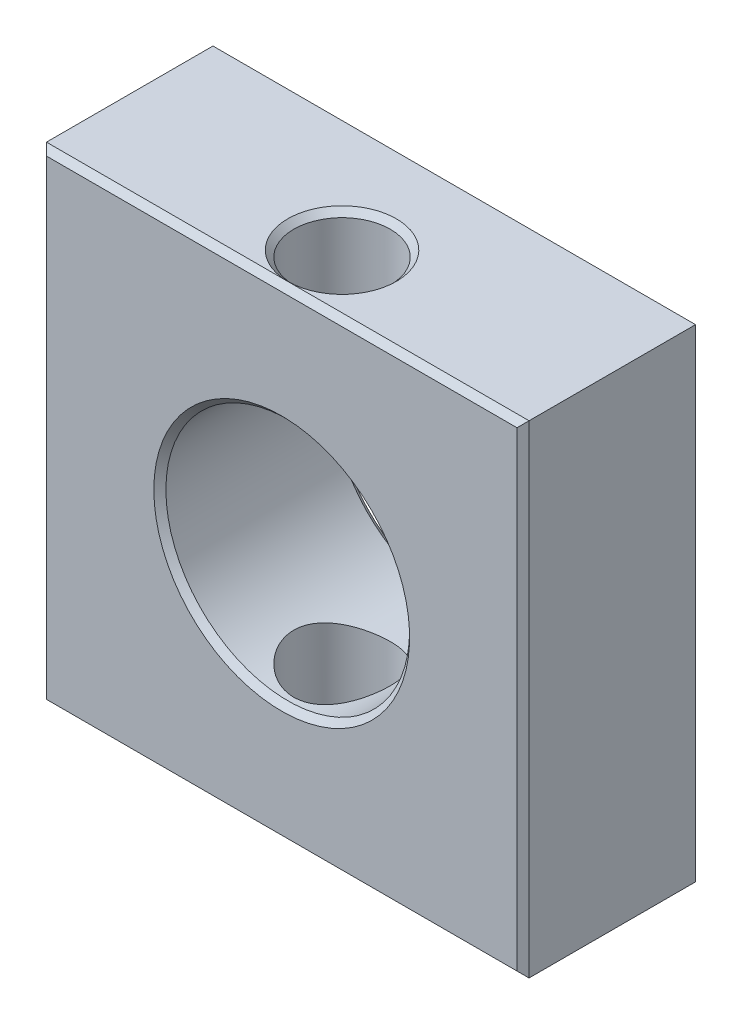
ISO-10303-21;
HEADER;
FILE_DESCRIPTION(('STEP AP214'),'2;1');
FILE_NAME('part.step','',(''),(''),'','','');
FILE_SCHEMA(('AUTOMOTIVE_DESIGN { 1 0 10303 214 1 1 1 1 }'));
ENDSEC;
DATA;
#1=APPLICATION_CONTEXT('core data for automotive mechanical design processes');
#2=APPLICATION_PROTOCOL_DEFINITION('international standard','automotive_design',2000,#1);
#3=PRODUCT_CONTEXT('',#1,'mechanical');
#4=PRODUCT('Part','Part','',(#3));
#5=PRODUCT_RELATED_PRODUCT_CATEGORY('part','',(#4));
#6=PRODUCT_DEFINITION_FORMATION('','',#4);
#7=PRODUCT_DEFINITION_CONTEXT('part definition',#1,'design');
#8=PRODUCT_DEFINITION('design','',#6,#7);
#9=PRODUCT_DEFINITION_SHAPE('','',#8);
#10=(LENGTH_UNIT() NAMED_UNIT(*) SI_UNIT(.MILLI.,.METRE.));
#11=(NAMED_UNIT(*) PLANE_ANGLE_UNIT() SI_UNIT($,.RADIAN.));
#12=(NAMED_UNIT(*) SI_UNIT($,.STERADIAN.) SOLID_ANGLE_UNIT());
#13=UNCERTAINTY_MEASURE_WITH_UNIT(LENGTH_MEASURE(1.E-05),#10,'distance_accuracy_value','');
#14=(GEOMETRIC_REPRESENTATION_CONTEXT(3) GLOBAL_UNCERTAINTY_ASSIGNED_CONTEXT((#13)) GLOBAL_UNIT_ASSIGNED_CONTEXT((#10,
#11,#12)) REPRESENTATION_CONTEXT('',''));
#15=CARTESIAN_POINT('',(0.,0.,0.));
#16=DIRECTION('',(0.,0.,1.));
#17=DIRECTION('',(1.,0.,0.));
#18=AXIS2_PLACEMENT_3D('',#15,#16,#17);
#19=CARTESIAN_POINT('',(0.,0.,7.4));
#20=DIRECTION('',(0.,0.,-1.));
#21=DIRECTION('',(-1.,0.,0.));
#22=AXIS2_PLACEMENT_3D('',#19,#20,#21);
#23=PLANE('',#22);
#24=CARTESIAN_POINT('',(0.,0.,7.4));
#25=DIRECTION('',(0.,0.,-1.));
#26=DIRECTION('',(-1.,0.,0.));
#27=AXIS2_PLACEMENT_3D('',#24,#25,#26);
#28=CIRCLE('',#27,5.3);
#29=CARTESIAN_POINT('',(-5.3,0.,7.4));
#30=VERTEX_POINT('',#29);
#31=EDGE_CURVE('E212',#30,#30,#28,.T.);
#32=ORIENTED_EDGE('',*,*,#31,.T.);
#33=EDGE_LOOP('',(#32));
#34=FACE_BOUND('',#33,.T.);
#35=DIRECTION('',(0.,-1.,0.));
#36=VECTOR('',#35,1.);
#37=CARTESIAN_POINT('',(-9.75,0.,7.4));
#38=LINE('',#37,#36);
#39=CARTESIAN_POINT('',(-9.75,9.75000000000001,7.4));
#40=VERTEX_POINT('',#39);
#41=CARTESIAN_POINT('',(-9.75,-9.75,7.4));
#42=VERTEX_POINT('',#41);
#43=EDGE_CURVE('E60',#40,#42,#38,.T.);
#44=ORIENTED_EDGE('',*,*,#43,.T.);
#45=DIRECTION('',(1.,0.,0.));
#46=VECTOR('',#45,1.);
#47=CARTESIAN_POINT('',(0.,-9.75,7.4));
#48=LINE('',#47,#46);
#49=CARTESIAN_POINT('',(9.75,-9.75,7.4));
#50=VERTEX_POINT('',#49);
#51=EDGE_CURVE('E209',#42,#50,#48,.T.);
#52=ORIENTED_EDGE('',*,*,#51,.T.);
#53=DIRECTION('',(0.,1.,0.));
#54=VECTOR('',#53,1.);
#55=CARTESIAN_POINT('',(9.75,0.,7.4));
#56=LINE('',#55,#54);
#57=CARTESIAN_POINT('',(9.75,9.75000000000001,7.4));
#58=VERTEX_POINT('',#57);
#59=EDGE_CURVE('E202',#50,#58,#56,.T.);
#60=ORIENTED_EDGE('',*,*,#59,.T.);
#61=DIRECTION('',(-1.,0.,0.));
#62=VECTOR('',#61,1.);
#63=CARTESIAN_POINT('',(0.,9.75000000000001,7.4));
#64=LINE('',#63,#62);
#65=EDGE_CURVE('E65',#58,#40,#64,.T.);
#66=ORIENTED_EDGE('',*,*,#65,.T.);
#67=EDGE_LOOP('',(#44,#52,#60,#66));
#68=FACE_BOUND('',#67,.T.);
#69=ADVANCED_FACE('F41',(#34,#68),#23,.F.);
#70=CARTESIAN_POINT('',(0.,0.,0.));
#71=DIRECTION('',(0.,0.,-1.));
#72=DIRECTION('',(-1.,0.,0.));
#73=AXIS2_PLACEMENT_3D('',#70,#71,#72);
#74=PLANE('',#73);
#75=CARTESIAN_POINT('',(0.,0.,0.));
#76=DIRECTION('',(0.,0.,-1.));
#77=DIRECTION('',(-1.,0.,0.));
#78=AXIS2_PLACEMENT_3D('',#75,#76,#77);
#79=CIRCLE('',#78,5.3);
#80=CARTESIAN_POINT('',(-5.3,0.,0.));
#81=VERTEX_POINT('',#80);
#82=EDGE_CURVE('E146',#81,#81,#79,.F.);
#83=ORIENTED_EDGE('',*,*,#82,.T.);
#84=EDGE_LOOP('',(#83));
#85=FACE_BOUND('',#84,.T.);
#86=DIRECTION('',(0.,1.,0.));
#87=VECTOR('',#86,1.);
#88=CARTESIAN_POINT('',(-9.75,10.,0.));
#89=LINE('',#88,#87);
#90=CARTESIAN_POINT('',(-9.75,-9.75,0.));
#91=VERTEX_POINT('',#90);
#92=CARTESIAN_POINT('',(-9.75,9.75,0.));
#93=VERTEX_POINT('',#92);
#94=EDGE_CURVE('E144',#91,#93,#89,.T.);
#95=ORIENTED_EDGE('',*,*,#94,.T.);
#96=DIRECTION('',(1.,0.,0.));
#97=VECTOR('',#96,1.);
#98=CARTESIAN_POINT('',(10.,9.75,0.));
#99=LINE('',#98,#97);
#100=CARTESIAN_POINT('',(9.75,9.75,0.));
#101=VERTEX_POINT('',#100);
#102=EDGE_CURVE('E121',#93,#101,#99,.T.);
#103=ORIENTED_EDGE('',*,*,#102,.T.);
#104=DIRECTION('',(0.,-1.,0.));
#105=VECTOR('',#104,1.);
#106=CARTESIAN_POINT('',(9.75,-10.,0.));
#107=LINE('',#106,#105);
#108=CARTESIAN_POINT('',(9.75,-9.75,0.));
#109=VERTEX_POINT('',#108);
#110=EDGE_CURVE('E132',#101,#109,#107,.T.);
#111=ORIENTED_EDGE('',*,*,#110,.T.);
#112=DIRECTION('',(-1.,0.,0.));
#113=VECTOR('',#112,1.);
#114=CARTESIAN_POINT('',(-10.,-9.75,0.));
#115=LINE('',#114,#113);
#116=EDGE_CURVE('E139',#109,#91,#115,.T.);
#117=ORIENTED_EDGE('',*,*,#116,.T.);
#118=EDGE_LOOP('',(#95,#103,#111,#117));
#119=FACE_BOUND('',#118,.T.);
#120=ADVANCED_FACE('F142',(#85,#119),#74,.T.);
#121=CARTESIAN_POINT('',(10.,-10.,7.4));
#122=DIRECTION('',(-1.,0.,0.));
#123=DIRECTION('',(0.,0.,1.));
#124=AXIS2_PLACEMENT_3D('',#121,#122,#123);
#125=PLANE('',#124);
#126=DIRECTION('',(0.,0.,-1.));
#127=VECTOR('',#126,1.);
#128=CARTESIAN_POINT('',(10.,-10.,7.4));
#129=LINE('',#128,#127);
#130=CARTESIAN_POINT('',(10.,-10.,7.15));
#131=VERTEX_POINT('',#130);
#132=CARTESIAN_POINT('',(10.,-10.,0.249999999999997));
#133=VERTEX_POINT('',#132);
#134=EDGE_CURVE('E263',#131,#133,#129,.T.);
#135=ORIENTED_EDGE('',*,*,#134,.T.);
#136=DIRECTION('',(0.,1.,0.));
#137=VECTOR('',#136,1.);
#138=CARTESIAN_POINT('',(10.,10.,0.249999999999997));
#139=LINE('',#138,#137);
#140=CARTESIAN_POINT('',(10.,10.,0.249999999999997));
#141=VERTEX_POINT('',#140);
#142=EDGE_CURVE('E199',#133,#141,#139,.T.);
#143=ORIENTED_EDGE('',*,*,#142,.T.);
#144=DIRECTION('',(0.,0.,-1.));
#145=VECTOR('',#144,1.);
#146=CARTESIAN_POINT('',(10.,10.,7.4));
#147=LINE('',#146,#145);
#148=CARTESIAN_POINT('',(10.,10.,7.15));
#149=VERTEX_POINT('',#148);
#150=EDGE_CURVE('E140',#149,#141,#147,.T.);
#151=ORIENTED_EDGE('',*,*,#150,.F.);
#152=DIRECTION('',(0.,-1.,0.));
#153=VECTOR('',#152,1.);
#154=CARTESIAN_POINT('',(10.,-10.,7.15));
#155=LINE('',#154,#153);
#156=EDGE_CURVE('E196',#149,#131,#155,.T.);
#157=ORIENTED_EDGE('',*,*,#156,.T.);
#158=EDGE_LOOP('',(#135,#143,#151,#157));
#159=FACE_BOUND('',#158,.T.);
#160=ADVANCED_FACE('F302',(#159),#125,.F.);
#161=CARTESIAN_POINT('',(-10.,10.,7.4));
#162=DIRECTION('',(0.,-1.,0.));
#163=DIRECTION('',(0.,0.,-1.));
#164=AXIS2_PLACEMENT_3D('',#161,#162,#163);
#165=PLANE('',#164);
#166=ORIENTED_EDGE('',*,*,#150,.T.);
#167=DIRECTION('',(-1.,0.,0.));
#168=VECTOR('',#167,1.);
#169=CARTESIAN_POINT('',(-10.,10.,0.249999999999997));
#170=LINE('',#169,#168);
#171=CARTESIAN_POINT('',(-10.,10.,0.249999999999997));
#172=VERTEX_POINT('',#171);
#173=EDGE_CURVE('E124',#141,#172,#170,.T.);
#174=ORIENTED_EDGE('',*,*,#173,.T.);
#175=DIRECTION('',(0.,0.,-1.));
#176=VECTOR('',#175,1.);
#177=CARTESIAN_POINT('',(-10.,10.,7.4));
#178=LINE('',#177,#176);
#179=CARTESIAN_POINT('',(-10.,10.,7.15));
#180=VERTEX_POINT('',#179);
#181=EDGE_CURVE('E254',#180,#172,#178,.T.);
#182=ORIENTED_EDGE('',*,*,#181,.F.);
#183=DIRECTION('',(1.,0.,0.));
#184=VECTOR('',#183,1.);
#185=CARTESIAN_POINT('',(-10.,10.,7.15));
#186=LINE('',#185,#184);
#187=CARTESIAN_POINT('',(0.,10.,7.15));
#188=VERTEX_POINT('',#187);
#189=EDGE_CURVE('E170',#180,#188,#186,.T.);
#190=ORIENTED_EDGE('',*,*,#189,.T.);
#191=CARTESIAN_POINT('',(0.,10.,4.9));
#192=DIRECTION('',(0.,-1.,0.));
#193=DIRECTION('',(0.,0.,-1.));
#194=AXIS2_PLACEMENT_3D('',#191,#192,#193);
#195=CIRCLE('',#194,2.25);
#196=EDGE_CURVE('E163',#188,#188,#195,.T.);
#197=ORIENTED_EDGE('',*,*,#196,.T.);
#198=DIRECTION('',(1.,0.,0.));
#199=VECTOR('',#198,1.);
#200=CARTESIAN_POINT('',(-10.,10.,7.15));
#201=LINE('',#200,#199);
#202=EDGE_CURVE('E167',#188,#149,#201,.T.);
#203=ORIENTED_EDGE('',*,*,#202,.T.);
#204=EDGE_LOOP('',(#166,#174,#182,#190,#197,#203));
#205=FACE_BOUND('',#204,.T.);
#206=ADVANCED_FACE('F252',(#205),#165,.F.);
#207=CARTESIAN_POINT('',(-10.,-10.,7.4));
#208=DIRECTION('',(1.,0.,0.));
#209=DIRECTION('',(0.,0.,-1.));
#210=AXIS2_PLACEMENT_3D('',#207,#208,#209);
#211=PLANE('',#210);
#212=ORIENTED_EDGE('',*,*,#181,.T.);
#213=DIRECTION('',(0.,-1.,0.));
#214=VECTOR('',#213,1.);
#215=CARTESIAN_POINT('',(-10.,-10.,0.249999999999997));
#216=LINE('',#215,#214);
#217=CARTESIAN_POINT('',(-10.,-10.,0.249999999999997));
#218=VERTEX_POINT('',#217);
#219=EDGE_CURVE('E179',#172,#218,#216,.T.);
#220=ORIENTED_EDGE('',*,*,#219,.T.);
#221=DIRECTION('',(0.,0.,-1.));
#222=VECTOR('',#221,1.);
#223=CARTESIAN_POINT('',(-10.,-10.,7.4));
#224=LINE('',#223,#222);
#225=CARTESIAN_POINT('',(-10.,-10.,7.15));
#226=VERTEX_POINT('',#225);
#227=EDGE_CURVE('E257',#226,#218,#224,.T.);
#228=ORIENTED_EDGE('',*,*,#227,.F.);
#229=DIRECTION('',(0.,1.,0.));
#230=VECTOR('',#229,1.);
#231=CARTESIAN_POINT('',(-10.,-10.,7.15));
#232=LINE('',#231,#230);
#233=EDGE_CURVE('E176',#226,#180,#232,.T.);
#234=ORIENTED_EDGE('',*,*,#233,.T.);
#235=EDGE_LOOP('',(#212,#220,#228,#234));
#236=FACE_BOUND('',#235,.T.);
#237=ADVANCED_FACE('F308',(#236),#211,.F.);
#238=CARTESIAN_POINT('',(-10.,-10.,7.4));
#239=DIRECTION('',(0.,1.,0.));
#240=DIRECTION('',(0.,0.,1.));
#241=AXIS2_PLACEMENT_3D('',#238,#239,#240);
#242=PLANE('',#241);
#243=ORIENTED_EDGE('',*,*,#227,.T.);
#244=DIRECTION('',(1.,0.,0.));
#245=VECTOR('',#244,1.);
#246=CARTESIAN_POINT('',(10.,-10.,0.249999999999997));
#247=LINE('',#246,#245);
#248=EDGE_CURVE('E193',#218,#133,#247,.T.);
#249=ORIENTED_EDGE('',*,*,#248,.T.);
#250=ORIENTED_EDGE('',*,*,#134,.F.);
#251=DIRECTION('',(-1.,0.,0.));
#252=VECTOR('',#251,1.);
#253=CARTESIAN_POINT('',(-10.,-10.,7.15));
#254=LINE('',#253,#252);
#255=CARTESIAN_POINT('',(0.,-10.,7.15));
#256=VERTEX_POINT('',#255);
#257=EDGE_CURVE('E189',#131,#256,#254,.T.);
#258=ORIENTED_EDGE('',*,*,#257,.T.);
#259=CARTESIAN_POINT('',(0.,-10.,4.9));
#260=DIRECTION('',(0.,1.,0.));
#261=DIRECTION('',(0.,0.,1.));
#262=AXIS2_PLACEMENT_3D('',#259,#260,#261);
#263=CIRCLE('',#262,2.25);
#264=EDGE_CURVE('E182',#256,#256,#263,.T.);
#265=ORIENTED_EDGE('',*,*,#264,.T.);
#266=DIRECTION('',(-1.,0.,0.));
#267=VECTOR('',#266,1.);
#268=CARTESIAN_POINT('',(-10.,-10.,7.15));
#269=LINE('',#268,#267);
#270=EDGE_CURVE('E186',#256,#226,#269,.T.);
#271=ORIENTED_EDGE('',*,*,#270,.T.);
#272=EDGE_LOOP('',(#243,#249,#250,#258,#265,#271));
#273=FACE_BOUND('',#272,.T.);
#274=ADVANCED_FACE('F294',(#273),#242,.F.);
#275=CARTESIAN_POINT('',(0.,0.,7.4));
#276=DIRECTION('',(0.,0.,-1.));
#277=DIRECTION('',(-1.,0.,0.));
#278=AXIS2_PLACEMENT_3D('',#275,#276,#277);
#279=CYLINDRICAL_SURFACE('',#278,5.05);
#280=CARTESIAN_POINT('',(0.,0.,0.250000000000001));
#281=DIRECTION('',(0.,0.,-1.));
#282=DIRECTION('',(-1.,0.,0.));
#283=AXIS2_PLACEMENT_3D('',#280,#281,#282);
#284=CIRCLE('',#283,5.05);
#285=CARTESIAN_POINT('',(-5.05,0.,0.250000000000001));
#286=VERTEX_POINT('',#285);
#287=EDGE_CURVE('E159',#286,#286,#284,.T.);
#288=ORIENTED_EDGE('',*,*,#287,.T.);
#289=EDGE_LOOP('',(#288));
#290=FACE_BOUND('',#289,.T.);
#291=CARTESIAN_POINT('',(0.,0.,7.15));
#292=DIRECTION('',(0.,0.,-1.));
#293=DIRECTION('',(-1.,0.,0.));
#294=AXIS2_PLACEMENT_3D('',#291,#292,#293);
#295=CIRCLE('',#294,5.05);
#296=CARTESIAN_POINT('',(-5.05,0.,7.15));
#297=VERTEX_POINT('',#296);
#298=EDGE_CURVE('E151',#297,#297,#295,.F.);
#299=ORIENTED_EDGE('',*,*,#298,.T.);
#300=EDGE_LOOP('',(#299));
#301=FACE_BOUND('',#300,.T.);
#302=CARTESIAN_POINT('',(0.,-5.05,6.9));
#303=CARTESIAN_POINT('',(0.107606923407257,-5.04999190030314,6.89998888088055));
#304=CARTESIAN_POINT('',(0.215372150571609,-5.04652109783298,6.89126627786824));
#305=CARTESIAN_POINT('',(0.427862910360448,-5.03297536591887,6.85667608369071));
#306=CARTESIAN_POINT('',(0.532580032634758,-5.02288369491007,6.83076502785778));
#307=CARTESIAN_POINT('',(0.735570102037394,-4.99718593345495,6.76288695758719));
#308=CARTESIAN_POINT('',(0.833862341414831,-4.98159734457333,6.72097086668627));
#309=CARTESIAN_POINT('',(1.02193859653296,-4.94644389580464,6.62247419051256));
#310=CARTESIAN_POINT('',(1.11172513968645,-4.92688022255654,6.56589798018252));
#311=CARTESIAN_POINT('',(1.28452104218351,-4.88474645370079,6.43691703688315));
#312=CARTESIAN_POINT('',(1.36708426934581,-4.86208430423305,6.36394490901279));
#313=CARTESIAN_POINT('',(1.51917593364277,-4.81673287826779,6.20544167419001));
#314=CARTESIAN_POINT('',(1.58869830209108,-4.79404359406112,6.11990475294462));
#315=CARTESIAN_POINT('',(1.71570812214043,-4.7501120595874,5.93418497510735));
#316=CARTESIAN_POINT('',(1.77254158183707,-4.7289754846863,5.83352730850341));
#317=CARTESIAN_POINT('',(1.86827242887644,-4.69198377265426,5.62311790190743));
#318=CARTESIAN_POINT('',(1.90717810703915,-4.67612619516004,5.51337039333095));
#319=CARTESIAN_POINT('',(1.96415260926031,-4.65247495964192,5.29302208011897));
#320=CARTESIAN_POINT('',(1.98307467215481,-4.64435269449542,5.18267843819949));
#321=CARTESIAN_POINT('',(2.00221059278242,-4.63613766680588,4.96010628966715));
#322=CARTESIAN_POINT('',(2.00243341290737,-4.63604105763277,4.84787871180796));
#323=CARTESIAN_POINT('',(1.98481210142394,-4.64360743115311,4.63285800635808));
#324=CARTESIAN_POINT('',(1.96819519526939,-4.65074333585307,4.52994218054293));
#325=CARTESIAN_POINT('',(1.9194095435463,-4.67108746187081,4.32850091931688));
#326=CARTESIAN_POINT('',(1.88723814237041,-4.68429672006884,4.22997623674086));
#327=CARTESIAN_POINT('',(1.807648699654,-4.7155868690567,4.0377653807596));
#328=CARTESIAN_POINT('',(1.75993599802411,-4.73376071632039,3.94421702408108));
#329=CARTESIAN_POINT('',(1.65082495091307,-4.77290587847201,3.76611559676011));
#330=CARTESIAN_POINT('',(1.58942152965393,-4.79387822973287,3.68156587954619));
#331=CARTESIAN_POINT('',(1.44921077922004,-4.83819012693915,3.51713152662959));
#332=CARTESIAN_POINT('',(1.3694382786571,-4.86158873072547,3.43808361724743));
#333=CARTESIAN_POINT('',(1.19751648157379,-4.90676544264421,3.29422290727554));
#334=CARTESIAN_POINT('',(1.10536482144606,-4.92854324007189,3.22941283142115));
#335=CARTESIAN_POINT('',(0.908966199591368,-4.96855095644644,3.11479857272105));
#336=CARTESIAN_POINT('',(0.804522497099702,-4.98670550368808,3.06530329842777));
#337=CARTESIAN_POINT('',(0.587890340699852,-5.01685318908848,2.98487183830569));
#338=CARTESIAN_POINT('',(0.47570577180008,-5.02884939286397,2.95392641709104));
#339=CARTESIAN_POINT('',(0.253794599195058,-5.04477324571285,2.91315168943115));
#340=CARTESIAN_POINT('',(0.144305351595354,-5.04913011086972,2.90219756161118));
#341=CARTESIAN_POINT('',(-0.0750226277240138,-5.05063225809603,2.89840249491338));
#342=CARTESIAN_POINT('',(-0.184861264031522,-5.04777936413892,2.90555697479865));
#343=CARTESIAN_POINT('',(-0.396710384108172,-5.03546393637181,2.93694423997488));
#344=CARTESIAN_POINT('',(-0.498852918618658,-5.02629677234525,2.96041425193825));
#345=CARTESIAN_POINT('',(-0.697659591982185,-5.0025794266639,3.02273392840414));
#346=CARTESIAN_POINT('',(-0.794323023308307,-4.9880285516183,3.0615855740172));
#347=CARTESIAN_POINT('',(-0.982735383441326,-4.95440938256358,3.1548305306965));
#348=CARTESIAN_POINT('',(-1.07424521506788,-4.93521708393519,3.20966084740787));
#349=CARTESIAN_POINT('',(-1.24708468498451,-4.89440282252653,3.33282054138869));
#350=CARTESIAN_POINT('',(-1.32841026780473,-4.87277989830977,3.4011552685008));
#351=CARTESIAN_POINT('',(-1.48409330195476,-4.82772781833309,3.55457500757754));
#352=CARTESIAN_POINT('',(-1.55765882460358,-4.80427235202533,3.64045800333768));
#353=CARTESIAN_POINT('',(-1.68952201641345,-4.75950392058224,3.82377304707458));
#354=CARTESIAN_POINT('',(-1.74781737713167,-4.73819127968491,3.9212068379945));
#355=CARTESIAN_POINT('',(-1.84779923464827,-4.70011056185315,4.12621163356864));
#356=CARTESIAN_POINT('',(-1.88933666343104,-4.68338367999428,4.23386353314456));
#357=CARTESIAN_POINT('',(-1.95338030113416,-4.65704063029895,4.45549414825259));
#358=CARTESIAN_POINT('',(-1.97590017046172,-4.64741935909147,4.56946825968745));
#359=CARTESIAN_POINT('',(-1.99997680860957,-4.63710559999181,4.79181925846487));
#360=CARTESIAN_POINT('',(-2.0029039642495,-4.63582957244317,4.90002166141682));
#361=CARTESIAN_POINT('',(-1.99129654945168,-4.6408272745246,5.11529730504329));
#362=CARTESIAN_POINT('',(-1.97676409014526,-4.64710009138544,5.2223706806552));
#363=CARTESIAN_POINT('',(-1.93176104938418,-4.66597852985828,5.42818621508286));
#364=CARTESIAN_POINT('',(-1.9019170319717,-4.67833447469989,5.52709034539136));
#365=CARTESIAN_POINT('',(-1.82771870345211,-4.70781581606134,5.7185296892596));
#366=CARTESIAN_POINT('',(-1.78336055248103,-4.72494247454427,5.81106320955867));
#367=CARTESIAN_POINT('',(-1.67849533607532,-4.76323765464958,5.99282980006178));
#368=CARTESIAN_POINT('',(-1.61721744369833,-4.78457987191135,6.08158098545595));
#369=CARTESIAN_POINT('',(-1.4813850234899,-4.82836258844649,6.24797683262723));
#370=CARTESIAN_POINT('',(-1.4068257626808,-4.85080347717068,6.3256175171959));
#371=CARTESIAN_POINT('',(-1.24094374340419,-4.89595717046953,6.47260899605522));
#372=CARTESIAN_POINT('',(-1.14885957471053,-4.91859760798441,6.54112633376172));
#373=CARTESIAN_POINT('',(-0.953662531742747,-4.9601371685954,6.66172552734572));
#374=CARTESIAN_POINT('',(-0.850548267298623,-4.9790358192404,6.71380530825233));
#375=CARTESIAN_POINT('',(-0.645323543208292,-5.00958023970845,6.79597408513361));
#376=CARTESIAN_POINT('',(-0.543884412356105,-5.02170878845616,6.8275652179505));
#377=CARTESIAN_POINT('',(-0.336929824452451,-5.03981031386005,6.87425058445471));
#378=CARTESIAN_POINT('',(-0.231426346274327,-5.04580012903862,6.88938995219775));
#379=CARTESIAN_POINT('',(-0.0836946625727666,-5.04948231655396,6.89869040668932));
#380=CARTESIAN_POINT('',(-0.0418593087511468,-5.0500031507983,6.90000432535974));
#381=CARTESIAN_POINT('',(0.,-5.05,6.9));
#382=B_SPLINE_CURVE_WITH_KNOTS('',3,(#302,#303,#304,#305,#306,#307,#308,#309,#310,#311,#312,
#313,#314,#315,#316,#317,#318,#319,#320,#321,#322,#323,#324,#325,#326,#327,#328,#329,#330,#331,
#332,#333,#334,#335,#336,#337,#338,#339,#340,#341,#342,#343,#344,#345,#346,#347,#348,#349,#350,
#351,#352,#353,#354,#355,#356,#357,#358,#359,#360,#361,#362,#363,#364,#365,#366,#367,#368,#369,
#370,#371,#372,#373,#374,#375,#376,#377,#378,#379,#380,#381),.UNSPECIFIED.,.T.,.F.,(4,2,2,2,2,2,
2,2,2,2,2,2,2,2,2,2,2,2,2,2,2,2,2,2,2,2,2,2,2,2,2,2,2,2,2,2,2,2,2,4),(0.,0.322695688347146,
0.646210508064534,0.968704457653795,1.2911022776771,1.62711066527251,1.96327503170148,
2.31404245392794,2.66464749826208,2.99958921184186,3.33437038972116,3.64639195912547,
3.95846681856109,4.27684123085698,4.59533387601037,4.93791942111705,5.28057047080699,
5.62973973874267,5.97873502163309,6.30740516700479,6.6359921715123,6.95016817059568,
7.26438464782267,7.58816389618872,7.91207166945281,8.25694839095775,8.60187721861166,
8.94981002966628,9.2974927057617,9.62057737874948,9.94362298984866,10.2543941845609,
10.5652476635703,10.893664799106,11.2221992050871,11.571486458424,11.9208177859069,
12.2402107232988,12.5587252031032,12.6842544722569),.UNSPECIFIED.);
#383=CARTESIAN_POINT('',(0.,-5.05,6.9));
#384=VERTEX_POINT('',#383);
#385=EDGE_CURVE('E275',#384,#384,#382,.T.);
#386=ORIENTED_EDGE('',*,*,#385,.F.);
#387=EDGE_LOOP('',(#386));
#388=FACE_BOUND('',#387,.T.);
#389=CARTESIAN_POINT('',(0.,5.05,6.9));
#390=CARTESIAN_POINT('',(-0.107606923407254,5.04999190030314,6.89998888088055));
#391=CARTESIAN_POINT('',(-0.215372150571606,5.04652109783299,6.89126627786824));
#392=CARTESIAN_POINT('',(-0.427862910360445,5.03297536591887,6.85667608369071));
#393=CARTESIAN_POINT('',(-0.532580032634754,5.02288369491007,6.83076502785778));
#394=CARTESIAN_POINT('',(-0.73557010203739,4.99718593345495,6.76288695758719));
#395=CARTESIAN_POINT('',(-0.833862341414827,4.98159734457333,6.72097086668627));
#396=CARTESIAN_POINT('',(-1.02193859653296,4.94644389580464,6.62247419051256));
#397=CARTESIAN_POINT('',(-1.11172513968645,4.92688022255654,6.56589798018252));
#398=CARTESIAN_POINT('',(-1.28452104218351,4.88474645370079,6.43691703688315));
#399=CARTESIAN_POINT('',(-1.36708426934581,4.86208430423305,6.36394490901279));
#400=CARTESIAN_POINT('',(-1.51917593364276,4.81673287826779,6.20544167419001));
#401=CARTESIAN_POINT('',(-1.58869830209108,4.79404359406112,6.11990475294462));
#402=CARTESIAN_POINT('',(-1.71570812214043,4.7501120595874,5.93418497510734));
#403=CARTESIAN_POINT('',(-1.77254158183706,4.7289754846863,5.83352730850341));
#404=CARTESIAN_POINT('',(-1.86827242887643,4.69198377265426,5.62311790190743));
#405=CARTESIAN_POINT('',(-1.90717810703914,4.67612619516004,5.51337039333094));
#406=CARTESIAN_POINT('',(-1.9641526092603,4.65247495964192,5.29302208011897));
#407=CARTESIAN_POINT('',(-1.9830746721548,4.64435269449542,5.18267843819949));
#408=CARTESIAN_POINT('',(-2.00221059278241,4.63613766680588,4.96010628966715));
#409=CARTESIAN_POINT('',(-2.00243341290737,4.63604105763278,4.84787871180796));
#410=CARTESIAN_POINT('',(-1.98481210142394,4.64360743115311,4.63285800635808));
#411=CARTESIAN_POINT('',(-1.96819519526939,4.65074333585307,4.52994218054292));
#412=CARTESIAN_POINT('',(-1.9194095435463,4.67108746187082,4.32850091931688));
#413=CARTESIAN_POINT('',(-1.88723814237041,4.68429672006884,4.22997623674086));
#414=CARTESIAN_POINT('',(-1.807648699654,4.7155868690567,4.0377653807596));
#415=CARTESIAN_POINT('',(-1.75993599802411,4.73376071632039,3.94421702408108));
#416=CARTESIAN_POINT('',(-1.65082495091307,4.77290587847201,3.76611559676011));
#417=CARTESIAN_POINT('',(-1.58942152965393,4.79387822973287,3.68156587954619));
#418=CARTESIAN_POINT('',(-1.44921077922004,4.83819012693916,3.51713152662959));
#419=CARTESIAN_POINT('',(-1.36943827865709,4.86158873072547,3.43808361724743));
#420=CARTESIAN_POINT('',(-1.19751648157379,4.90676544264421,3.29422290727554));
#421=CARTESIAN_POINT('',(-1.10536482144605,4.92854324007189,3.22941283142115));
#422=CARTESIAN_POINT('',(-0.908966199591364,4.96855095644644,3.11479857272105));
#423=CARTESIAN_POINT('',(-0.804522497099698,4.98670550368808,3.06530329842777));
#424=CARTESIAN_POINT('',(-0.587890340699848,5.01685318908848,2.98487183830569));
#425=CARTESIAN_POINT('',(-0.475705771800076,5.02884939286397,2.95392641709104));
#426=CARTESIAN_POINT('',(-0.253794599195054,5.04477324571285,2.91315168943116));
#427=CARTESIAN_POINT('',(-0.14430535159535,5.04913011086972,2.90219756161118));
#428=CARTESIAN_POINT('',(0.0750226277240177,5.05063225809603,2.89840249491338));
#429=CARTESIAN_POINT('',(0.184861264031526,5.04777936413892,2.90555697479865));
#430=CARTESIAN_POINT('',(0.396710384108176,5.03546393637181,2.93694423997488));
#431=CARTESIAN_POINT('',(0.498852918618662,5.02629677234525,2.96041425193825));
#432=CARTESIAN_POINT('',(0.697659591982189,5.0025794266639,3.02273392840414));
#433=CARTESIAN_POINT('',(0.794323023308311,4.9880285516183,3.06158557401721));
#434=CARTESIAN_POINT('',(0.982735383441329,4.95440938256358,3.1548305306965));
#435=CARTESIAN_POINT('',(1.07424521506789,4.93521708393519,3.20966084740787));
#436=CARTESIAN_POINT('',(1.24708468498452,4.89440282252653,3.33282054138869));
#437=CARTESIAN_POINT('',(1.32841026780473,4.87277989830977,3.4011552685008));
#438=CARTESIAN_POINT('',(1.48409330195476,4.82772781833309,3.55457500757754));
#439=CARTESIAN_POINT('',(1.55765882460358,4.80427235202533,3.64045800333768));
#440=CARTESIAN_POINT('',(1.68952201641345,4.75950392058224,3.82377304707458));
#441=CARTESIAN_POINT('',(1.74781737713168,4.73819127968491,3.9212068379945));
#442=CARTESIAN_POINT('',(1.84779923464828,4.70011056185315,4.12621163356864));
#443=CARTESIAN_POINT('',(1.88933666343105,4.68338367999428,4.23386353314456));
#444=CARTESIAN_POINT('',(1.95338030113417,4.65704063029895,4.45549414825259));
#445=CARTESIAN_POINT('',(1.97590017046172,4.64741935909146,4.56946825968745));
#446=CARTESIAN_POINT('',(1.99997680860958,4.63710559999181,4.79181925846487));
#447=CARTESIAN_POINT('',(2.0029039642495,4.63582957244317,4.90002166141682));
#448=CARTESIAN_POINT('',(1.99129654945169,4.6408272745246,5.11529730504329));
#449=CARTESIAN_POINT('',(1.97676409014527,4.64710009138544,5.2223706806552));
#450=CARTESIAN_POINT('',(1.93176104938418,4.66597852985828,5.42818621508286));
#451=CARTESIAN_POINT('',(1.90191703197171,4.67833447469989,5.52709034539136));
#452=CARTESIAN_POINT('',(1.82771870345211,4.70781581606134,5.7185296892596));
#453=CARTESIAN_POINT('',(1.78336055248103,4.72494247454427,5.81106320955867));
#454=CARTESIAN_POINT('',(1.67849533607532,4.76323765464958,5.99282980006178));
#455=CARTESIAN_POINT('',(1.61721744369834,4.78457987191135,6.08158098545595));
#456=CARTESIAN_POINT('',(1.4813850234899,4.82836258844649,6.24797683262723));
#457=CARTESIAN_POINT('',(1.4068257626808,4.85080347717068,6.3256175171959));
#458=CARTESIAN_POINT('',(1.2409437434042,4.89595717046953,6.47260899605522));
#459=CARTESIAN_POINT('',(1.14885957471053,4.91859760798441,6.54112633376172));
#460=CARTESIAN_POINT('',(0.953662531742751,4.9601371685954,6.66172552734572));
#461=CARTESIAN_POINT('',(0.850548267298626,4.9790358192404,6.71380530825233));
#462=CARTESIAN_POINT('',(0.645323543208296,5.00958023970845,6.79597408513361));
#463=CARTESIAN_POINT('',(0.543884412356109,5.02170878845616,6.82756521795049));
#464=CARTESIAN_POINT('',(0.336929824452456,5.03981031386005,6.87425058445471));
#465=CARTESIAN_POINT('',(0.231426346274332,5.04580012903862,6.88938995219775));
#466=CARTESIAN_POINT('',(0.0836946625727709,5.04948231655396,6.89869040668932));
#467=CARTESIAN_POINT('',(0.0418593087511507,5.0500031507983,6.90000432535974));
#468=CARTESIAN_POINT('',(0.,5.05,6.9));
#469=B_SPLINE_CURVE_WITH_KNOTS('',3,(#389,#390,#391,#392,#393,#394,#395,#396,#397,#398,#399,
#400,#401,#402,#403,#404,#405,#406,#407,#408,#409,#410,#411,#412,#413,#414,#415,#416,#417,#418,
#419,#420,#421,#422,#423,#424,#425,#426,#427,#428,#429,#430,#431,#432,#433,#434,#435,#436,#437,
#438,#439,#440,#441,#442,#443,#444,#445,#446,#447,#448,#449,#450,#451,#452,#453,#454,#455,#456,
#457,#458,#459,#460,#461,#462,#463,#464,#465,#466,#467,#468),.UNSPECIFIED.,.T.,.F.,(4,2,2,2,2,2,
2,2,2,2,2,2,2,2,2,2,2,2,2,2,2,2,2,2,2,2,2,2,2,2,2,2,2,2,2,2,2,2,2,4),(0.,0.322695688347146,
0.646210508064534,0.968704457653795,1.2911022776771,1.62711066527251,1.96327503170148,
2.31404245392794,2.66464749826208,2.99958921184186,3.33437038972116,3.64639195912547,
3.95846681856109,4.27684123085698,4.59533387601036,4.93791942111705,5.28057047080699,
5.62973973874267,5.97873502163309,6.30740516700479,6.6359921715123,6.95016817059568,
7.26438464782267,7.58816389618872,7.91207166945281,8.25694839095775,8.60187721861165,
8.94981002966628,9.2974927057617,9.62057737874948,9.94362298984866,10.2543941845609,
10.5652476635703,10.893664799106,11.2221992050871,11.571486458424,11.9208177859069,
12.2402107232988,12.5587252031032,12.6842544722569),.UNSPECIFIED.);
#470=CARTESIAN_POINT('',(0.,5.05,6.9));
#471=VERTEX_POINT('',#470);
#472=EDGE_CURVE('E226',#471,#471,#469,.T.);
#473=ORIENTED_EDGE('',*,*,#472,.F.);
#474=EDGE_LOOP('',(#473));
#475=FACE_BOUND('',#474,.T.);
#476=ADVANCED_FACE('F279',(#290,#301,#388,#475),#279,.F.);
#477=CARTESIAN_POINT('',(0.,-10.,4.9));
#478=DIRECTION('',(0.,1.,0.));
#479=DIRECTION('',(0.,0.,1.));
#480=AXIS2_PLACEMENT_3D('',#477,#478,#479);
#481=CYLINDRICAL_SURFACE('',#480,2.);
#482=CARTESIAN_POINT('',(0.,9.75000000000001,4.9));
#483=DIRECTION('',(0.,-1.,0.));
#484=DIRECTION('',(0.,0.,-1.));
#485=AXIS2_PLACEMENT_3D('',#482,#483,#484);
#486=CIRCLE('',#485,2.);
#487=CARTESIAN_POINT('',(0.,9.75000000000001,2.9));
#488=VERTEX_POINT('',#487);
#489=EDGE_CURVE('E11',#488,#488,#486,.F.);
#490=ORIENTED_EDGE('',*,*,#489,.T.);
#491=EDGE_LOOP('',(#490));
#492=FACE_BOUND('',#491,.T.);
#493=ORIENTED_EDGE('',*,*,#472,.T.);
#494=EDGE_LOOP('',(#493));
#495=FACE_BOUND('',#494,.T.);
#496=ADVANCED_FACE('F282',(#492,#495),#481,.F.);
#497=CARTESIAN_POINT('',(0.,-9.75,4.9));
#498=DIRECTION('',(0.,1.,0.));
#499=DIRECTION('',(0.,0.,1.));
#500=AXIS2_PLACEMENT_3D('',#497,#498,#499);
#501=CIRCLE('',#500,2.);
#502=CARTESIAN_POINT('',(0.,-9.75,6.9));
#503=VERTEX_POINT('',#502);
#504=EDGE_CURVE('E52',#503,#503,#501,.F.);
#505=ORIENTED_EDGE('',*,*,#504,.T.);
#506=EDGE_LOOP('',(#505));
#507=FACE_BOUND('',#506,.T.);
#508=ORIENTED_EDGE('',*,*,#385,.T.);
#509=EDGE_LOOP('',(#508));
#510=FACE_BOUND('',#509,.T.);
#511=ADVANCED_FACE('F285',(#507,#510),#481,.F.);
#512=CARTESIAN_POINT('',(0.,0.,0.));
#513=DIRECTION('',(0.,0.,-1.));
#514=DIRECTION('',(-1.,0.,0.));
#515=AXIS2_PLACEMENT_3D('',#512,#513,#514);
#516=CONICAL_SURFACE('',#515,5.3,0.785398163397448);
#517=ORIENTED_EDGE('',*,*,#287,.F.);
#518=EDGE_LOOP('',(#517));
#519=FACE_BOUND('',#518,.T.);
#520=ORIENTED_EDGE('',*,*,#82,.F.);
#521=EDGE_LOOP('',(#520));
#522=FACE_BOUND('',#521,.T.);
#523=ADVANCED_FACE('F292',(#519,#522),#516,.F.);
#524=CARTESIAN_POINT('',(-10.,-10.,0.249999999999997));
#525=DIRECTION('',(0.,-0.707106781186543,-0.707106781186552));
#526=DIRECTION('',(-1.,0.,0.));
#527=AXIS2_PLACEMENT_3D('',#524,#525,#526);
#528=PLANE('',#527);
#529=DIRECTION('',(0.577350269189628,0.577350269189628,-0.57735026918962));
#530=VECTOR('',#529,1.);
#531=CARTESIAN_POINT('',(-10.,-10.,0.249999999999997));
#532=LINE('',#531,#530);
#533=EDGE_CURVE('E128',#91,#218,#532,.F.);
#534=ORIENTED_EDGE('',*,*,#533,.F.);
#535=ORIENTED_EDGE('',*,*,#116,.F.);
#536=DIRECTION('',(-0.577350269189628,0.577350269189628,-0.57735026918962));
#537=VECTOR('',#536,1.);
#538=CARTESIAN_POINT('',(10.,-10.,0.249999999999997));
#539=LINE('',#538,#537);
#540=EDGE_CURVE('E135',#133,#109,#539,.T.);
#541=ORIENTED_EDGE('',*,*,#540,.F.);
#542=ORIENTED_EDGE('',*,*,#248,.F.);
#543=EDGE_LOOP('',(#534,#535,#541,#542));
#544=FACE_BOUND('',#543,.T.);
#545=ADVANCED_FACE('F323',(#544),#528,.T.);
#546=CARTESIAN_POINT('',(10.,-10.,0.249999999999997));
#547=DIRECTION('',(0.707106781186543,0.,-0.707106781186552));
#548=DIRECTION('',(0.,-1.,0.));
#549=AXIS2_PLACEMENT_3D('',#546,#547,#548);
#550=PLANE('',#549);
#551=ORIENTED_EDGE('',*,*,#540,.T.);
#552=ORIENTED_EDGE('',*,*,#110,.F.);
#553=DIRECTION('',(0.577350269189628,0.577350269189628,0.57735026918962));
#554=VECTOR('',#553,1.);
#555=CARTESIAN_POINT('',(3.33333333333327,3.33333333333327,-6.41666666666664));
#556=LINE('',#555,#554);
#557=EDGE_CURVE('E117',#141,#101,#556,.F.);
#558=ORIENTED_EDGE('',*,*,#557,.F.);
#559=ORIENTED_EDGE('',*,*,#142,.F.);
#560=EDGE_LOOP('',(#551,#552,#558,#559));
#561=FACE_BOUND('',#560,.T.);
#562=ADVANCED_FACE('F133',(#561),#550,.T.);
#563=CARTESIAN_POINT('',(-10.,-10.,0.249999999999997));
#564=DIRECTION('',(-0.707106781186543,0.,-0.707106781186552));
#565=DIRECTION('',(0.,1.,0.));
#566=AXIS2_PLACEMENT_3D('',#563,#564,#565);
#567=PLANE('',#566);
#568=ORIENTED_EDGE('',*,*,#533,.T.);
#569=ORIENTED_EDGE('',*,*,#219,.F.);
#570=DIRECTION('',(0.577350269189628,-0.577350269189628,-0.57735026918962));
#571=VECTOR('',#570,1.);
#572=CARTESIAN_POINT('',(-3.33333333333327,3.33333333333327,-6.41666666666664));
#573=LINE('',#572,#571);
#574=EDGE_CURVE('E129',#93,#172,#573,.F.);
#575=ORIENTED_EDGE('',*,*,#574,.F.);
#576=ORIENTED_EDGE('',*,*,#94,.F.);
#577=EDGE_LOOP('',(#568,#569,#575,#576));
#578=FACE_BOUND('',#577,.T.);
#579=ADVANCED_FACE('F333',(#578),#567,.T.);
#580=CARTESIAN_POINT('',(-10.,10.,0.249999999999997));
#581=DIRECTION('',(0.,0.707106781186543,-0.707106781186552));
#582=DIRECTION('',(1.,0.,0.));
#583=AXIS2_PLACEMENT_3D('',#580,#581,#582);
#584=PLANE('',#583);
#585=ORIENTED_EDGE('',*,*,#557,.T.);
#586=ORIENTED_EDGE('',*,*,#102,.F.);
#587=ORIENTED_EDGE('',*,*,#574,.T.);
#588=ORIENTED_EDGE('',*,*,#173,.F.);
#589=EDGE_LOOP('',(#585,#586,#587,#588));
#590=FACE_BOUND('',#589,.T.);
#591=ADVANCED_FACE('F119',(#590),#584,.T.);
#592=CARTESIAN_POINT('',(0.,0.,7.15));
#593=DIRECTION('',(0.,0.,1.));
#594=DIRECTION('',(1.,0.,0.));
#595=AXIS2_PLACEMENT_3D('',#592,#593,#594);
#596=CONICAL_SURFACE('',#595,5.05,0.785398163397448);
#597=ORIENTED_EDGE('',*,*,#31,.F.);
#598=EDGE_LOOP('',(#597));
#599=FACE_BOUND('',#598,.T.);
#600=ORIENTED_EDGE('',*,*,#298,.F.);
#601=EDGE_LOOP('',(#600));
#602=FACE_BOUND('',#601,.T.);
#603=ADVANCED_FACE('F332',(#599,#602),#596,.F.);
#604=CARTESIAN_POINT('',(0.,9.75000000000001,7.4));
#605=DIRECTION('',(0.,-0.707106781186552,-0.707106781186543));
#606=DIRECTION('',(-1.,0.,0.));
#607=AXIS2_PLACEMENT_3D('',#604,#605,#606);
#608=PLANE('',#607);
#609=ORIENTED_EDGE('',*,*,#202,.F.);
#610=ORIENTED_EDGE('',*,*,#189,.F.);
#611=DIRECTION('',(0.577350269189623,-0.577350269189623,0.577350269189631));
#612=VECTOR('',#611,1.);
#613=CARTESIAN_POINT('',(-6.50000000000003,6.50000000000004,10.65));
#614=LINE('',#613,#612);
#615=EDGE_CURVE('E46',#40,#180,#614,.F.);
#616=ORIENTED_EDGE('',*,*,#615,.F.);
#617=ORIENTED_EDGE('',*,*,#65,.F.);
#618=DIRECTION('',(-0.577350269189623,-0.577350269189623,0.577350269189631));
#619=VECTOR('',#618,1.);
#620=CARTESIAN_POINT('',(6.50000000000003,6.50000000000003,10.65));
#621=LINE('',#620,#619);
#622=EDGE_CURVE('E233',#149,#58,#621,.T.);
#623=ORIENTED_EDGE('',*,*,#622,.F.);
#624=EDGE_LOOP('',(#609,#610,#616,#617,#623));
#625=FACE_BOUND('',#624,.T.);
#626=ADVANCED_FACE('F248',(#625),#608,.F.);
#627=CARTESIAN_POINT('',(-9.75,0.,7.4));
#628=DIRECTION('',(0.707106781186552,0.,-0.707106781186543));
#629=DIRECTION('',(0.,-1.,0.));
#630=AXIS2_PLACEMENT_3D('',#627,#628,#629);
#631=PLANE('',#630);
#632=ORIENTED_EDGE('',*,*,#615,.T.);
#633=ORIENTED_EDGE('',*,*,#233,.F.);
#634=DIRECTION('',(0.577350269189623,0.577350269189623,0.577350269189631));
#635=VECTOR('',#634,1.);
#636=CARTESIAN_POINT('',(-6.50000000000003,-6.50000000000003,10.65));
#637=LINE('',#636,#635);
#638=EDGE_CURVE('E230',#42,#226,#637,.F.);
#639=ORIENTED_EDGE('',*,*,#638,.F.);
#640=ORIENTED_EDGE('',*,*,#43,.F.);
#641=EDGE_LOOP('',(#632,#633,#639,#640));
#642=FACE_BOUND('',#641,.T.);
#643=ADVANCED_FACE('F244',(#642),#631,.F.);
#644=CARTESIAN_POINT('',(9.75,0.,7.4));
#645=DIRECTION('',(-0.707106781186552,0.,-0.707106781186543));
#646=DIRECTION('',(0.,1.,0.));
#647=AXIS2_PLACEMENT_3D('',#644,#645,#646);
#648=PLANE('',#647);
#649=ORIENTED_EDGE('',*,*,#622,.T.);
#650=ORIENTED_EDGE('',*,*,#59,.F.);
#651=DIRECTION('',(0.577350269189623,-0.577350269189623,-0.577350269189631));
#652=VECTOR('',#651,1.);
#653=CARTESIAN_POINT('',(6.50000000000003,-6.50000000000003,10.65));
#654=LINE('',#653,#652);
#655=EDGE_CURVE('E227',#131,#50,#654,.F.);
#656=ORIENTED_EDGE('',*,*,#655,.F.);
#657=ORIENTED_EDGE('',*,*,#156,.F.);
#658=EDGE_LOOP('',(#649,#650,#656,#657));
#659=FACE_BOUND('',#658,.T.);
#660=ADVANCED_FACE('F364',(#659),#648,.F.);
#661=CARTESIAN_POINT('',(0.,-9.75,7.4));
#662=DIRECTION('',(0.,0.707106781186552,-0.707106781186543));
#663=DIRECTION('',(1.,0.,0.));
#664=AXIS2_PLACEMENT_3D('',#661,#662,#663);
#665=PLANE('',#664);
#666=ORIENTED_EDGE('',*,*,#270,.F.);
#667=ORIENTED_EDGE('',*,*,#257,.F.);
#668=ORIENTED_EDGE('',*,*,#655,.T.);
#669=ORIENTED_EDGE('',*,*,#51,.F.);
#670=ORIENTED_EDGE('',*,*,#638,.T.);
#671=EDGE_LOOP('',(#666,#667,#668,#669,#670));
#672=FACE_BOUND('',#671,.T.);
#673=ADVANCED_FACE('F356',(#672),#665,.F.);
#674=CARTESIAN_POINT('',(0.,-10.,4.9));
#675=DIRECTION('',(0.,-1.,0.));
#676=DIRECTION('',(0.,0.,-1.));
#677=AXIS2_PLACEMENT_3D('',#674,#675,#676);
#678=CONICAL_SURFACE('',#677,2.25,0.785398163397448);
#679=ORIENTED_EDGE('',*,*,#504,.F.);
#680=EDGE_LOOP('',(#679));
#681=FACE_BOUND('',#680,.T.);
#682=ORIENTED_EDGE('',*,*,#264,.F.);
#683=EDGE_LOOP('',(#682));
#684=FACE_BOUND('',#683,.T.);
#685=ADVANCED_FACE('F363',(#681,#684),#678,.F.);
#686=CARTESIAN_POINT('',(0.,9.75000000000001,4.9));
#687=DIRECTION('',(0.,1.,0.));
#688=DIRECTION('',(0.,0.,1.));
#689=AXIS2_PLACEMENT_3D('',#686,#687,#688);
#690=CONICAL_SURFACE('',#689,2.,0.785398163397459);
#691=ORIENTED_EDGE('',*,*,#196,.F.);
#692=EDGE_LOOP('',(#691));
#693=FACE_BOUND('',#692,.T.);
#694=ORIENTED_EDGE('',*,*,#489,.F.);
#695=EDGE_LOOP('',(#694));
#696=FACE_BOUND('',#695,.T.);
#697=ADVANCED_FACE('F44',(#693,#696),#690,.F.);
#698=CLOSED_SHELL('',(#69,#120,#160,#206,#237,#274,#476,#496,#511,#523,#545,#562,#579,#591,#603,
#626,#643,#660,#673,#685,#697));
#699=MANIFOLD_SOLID_BREP('B2',#698);
#700=ADVANCED_BREP_SHAPE_REPRESENTATION('',(#18,#699),#14);
#701=SHAPE_DEFINITION_REPRESENTATION(#9,#700);
ENDSEC;
END-ISO-10303-21;
